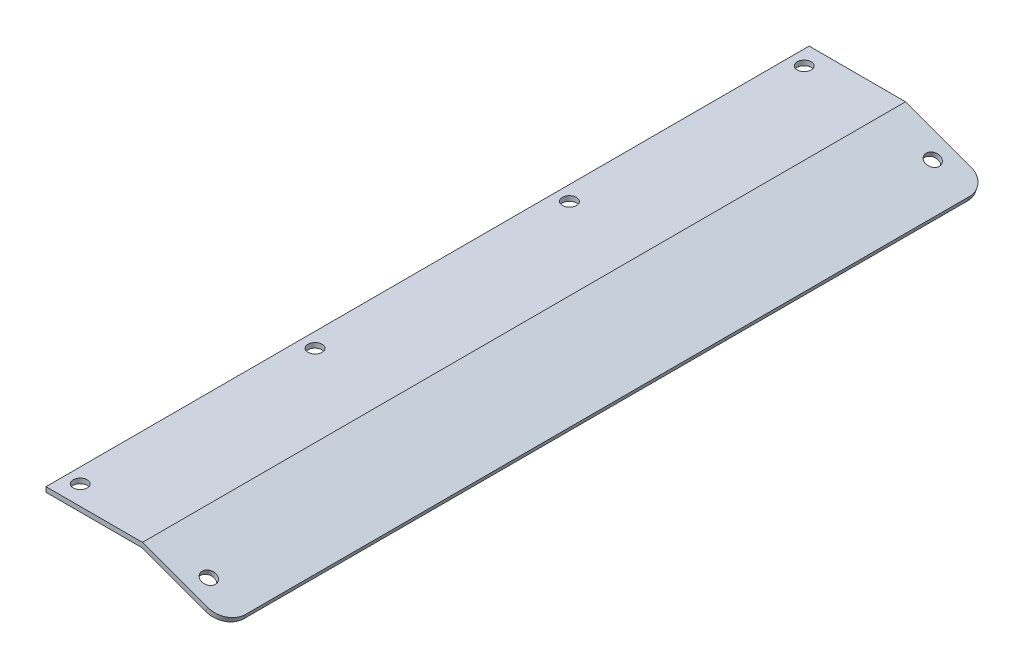
ISO-10303-21;
HEADER;
FILE_DESCRIPTION(('STEP AP214'),'2;1');
FILE_NAME('part.step','',(''),(''),'','','');
FILE_SCHEMA(('AUTOMOTIVE_DESIGN { 1 0 10303 214 1 1 1 1 }'));
ENDSEC;
DATA;
#1=APPLICATION_CONTEXT('core data for automotive mechanical design processes');
#2=APPLICATION_PROTOCOL_DEFINITION('international standard','automotive_design',2000,#1);
#3=PRODUCT_CONTEXT('',#1,'mechanical');
#4=PRODUCT('Part','Part','',(#3));
#5=PRODUCT_RELATED_PRODUCT_CATEGORY('part','',(#4));
#6=PRODUCT_DEFINITION_FORMATION('','',#4);
#7=PRODUCT_DEFINITION_CONTEXT('part definition',#1,'design');
#8=PRODUCT_DEFINITION('design','',#6,#7);
#9=PRODUCT_DEFINITION_SHAPE('','',#8);
#10=(LENGTH_UNIT() NAMED_UNIT(*) SI_UNIT(.MILLI.,.METRE.));
#11=(NAMED_UNIT(*) PLANE_ANGLE_UNIT() SI_UNIT($,.RADIAN.));
#12=(NAMED_UNIT(*) SI_UNIT($,.STERADIAN.) SOLID_ANGLE_UNIT());
#13=UNCERTAINTY_MEASURE_WITH_UNIT(LENGTH_MEASURE(1.E-05),#10,'distance_accuracy_value','');
#14=(GEOMETRIC_REPRESENTATION_CONTEXT(3) GLOBAL_UNCERTAINTY_ASSIGNED_CONTEXT((#13)) GLOBAL_UNIT_ASSIGNED_CONTEXT((#10,
#11,#12)) REPRESENTATION_CONTEXT('',''));
#15=CARTESIAN_POINT('',(0.,0.,0.));
#16=DIRECTION('',(0.,0.,1.));
#17=DIRECTION('',(1.,0.,0.));
#18=AXIS2_PLACEMENT_3D('',#15,#16,#17);
#19=CARTESIAN_POINT('',(0.,1.5875,307.158038592048));
#20=DIRECTION('',(1.,0.,0.));
#21=DIRECTION('',(0.,1.,0.));
#22=AXIS2_PLACEMENT_3D('',#19,#20,#21);
#23=PLANE('',#22);
#24=DIRECTION('',(0.,-1.,0.));
#25=VECTOR('',#24,1.);
#26=CARTESIAN_POINT('',(0.,1.58749999999937,247.649999999997));
#27=LINE('',#26,#25);
#28=CARTESIAN_POINT('',(0.,1.5875,247.649999999997));
#29=VERTEX_POINT('',#28);
#30=CARTESIAN_POINT('',(0.,0.,247.649999999996));
#31=VERTEX_POINT('',#30);
#32=EDGE_CURVE('E149',#29,#31,#27,.T.);
#33=ORIENTED_EDGE('',*,*,#32,.F.);
#34=DIRECTION('',(0.,0.,-1.));
#35=VECTOR('',#34,1.);
#36=CARTESIAN_POINT('',(0.,1.5875,307.158038592048));
#37=LINE('',#36,#35);
#38=CARTESIAN_POINT('',(0.,1.5875,0.));
#39=VERTEX_POINT('',#38);
#40=EDGE_CURVE('E146',#29,#39,#37,.T.);
#41=ORIENTED_EDGE('',*,*,#40,.T.);
#42=DIRECTION('',(0.,-1.,0.));
#43=VECTOR('',#42,1.);
#44=CARTESIAN_POINT('',(0.,1.5875,0.));
#45=LINE('',#44,#43);
#46=CARTESIAN_POINT('',(0.,0.,0.));
#47=VERTEX_POINT('',#46);
#48=EDGE_CURVE('E163',#39,#47,#45,.T.);
#49=ORIENTED_EDGE('',*,*,#48,.T.);
#50=DIRECTION('',(0.,0.,-1.));
#51=VECTOR('',#50,1.);
#52=CARTESIAN_POINT('',(0.,0.,307.158038592048));
#53=LINE('',#52,#51);
#54=EDGE_CURVE('E159',#31,#47,#53,.T.);
#55=ORIENTED_EDGE('',*,*,#54,.F.);
#56=EDGE_LOOP('',(#33,#41,#49,#55));
#57=FACE_BOUND('',#56,.T.);
#58=ADVANCED_FACE('F45',(#57),#23,.F.);
#59=CARTESIAN_POINT('',(0.,0.,307.158038592048));
#60=DIRECTION('',(0.,1.,0.));
#61=DIRECTION('',(-1.,0.,0.));
#62=AXIS2_PLACEMENT_3D('',#59,#60,#61);
#63=PLANE('',#62);
#64=CARTESIAN_POINT('',(4.7625,0.,6.35));
#65=DIRECTION('',(0.,1.,0.));
#66=DIRECTION('',(-1.,0.,0.));
#67=AXIS2_PLACEMENT_3D('',#64,#65,#66);
#68=CIRCLE('',#67,2.286);
#69=CARTESIAN_POINT('',(2.4765,0.,6.35));
#70=VERTEX_POINT('',#69);
#71=EDGE_CURVE('E177',#70,#70,#68,.T.);
#72=ORIENTED_EDGE('',*,*,#71,.T.);
#73=EDGE_LOOP('',(#72));
#74=FACE_BOUND('',#73,.T.);
#75=CARTESIAN_POINT('',(4.7625,0.,241.299999999997));
#76=DIRECTION('',(0.,1.,0.));
#77=DIRECTION('',(-1.,0.,0.));
#78=AXIS2_PLACEMENT_3D('',#75,#76,#77);
#79=CIRCLE('',#78,2.28600000000001);
#80=CARTESIAN_POINT('',(2.47649999999999,0.,241.299999999997));
#81=VERTEX_POINT('',#80);
#82=EDGE_CURVE('E311',#81,#81,#79,.T.);
#83=ORIENTED_EDGE('',*,*,#82,.T.);
#84=EDGE_LOOP('',(#83));
#85=FACE_BOUND('',#84,.T.);
#86=CARTESIAN_POINT('',(4.7625,0.,165.099999999997));
#87=DIRECTION('',(0.,1.,0.));
#88=DIRECTION('',(-1.,0.,0.));
#89=AXIS2_PLACEMENT_3D('',#86,#87,#88);
#90=CIRCLE('',#89,2.28600000000001);
#91=CARTESIAN_POINT('',(2.47649999999999,0.,165.099999999997));
#92=VERTEX_POINT('',#91);
#93=EDGE_CURVE('E308',#92,#92,#90,.T.);
#94=ORIENTED_EDGE('',*,*,#93,.T.);
#95=EDGE_LOOP('',(#94));
#96=FACE_BOUND('',#95,.T.);
#97=CARTESIAN_POINT('',(4.7625,0.,82.55));
#98=DIRECTION('',(0.,1.,0.));
#99=DIRECTION('',(-1.,0.,0.));
#100=AXIS2_PLACEMENT_3D('',#97,#98,#99);
#101=CIRCLE('',#100,2.286);
#102=CARTESIAN_POINT('',(2.4765,0.,82.55));
#103=VERTEX_POINT('',#102);
#104=EDGE_CURVE('E294',#103,#103,#101,.T.);
#105=ORIENTED_EDGE('',*,*,#104,.T.);
#106=EDGE_LOOP('',(#105));
#107=FACE_BOUND('',#106,.T.);
#108=DIRECTION('',(1.,0.,0.));
#109=VECTOR('',#108,1.);
#110=CARTESIAN_POINT('',(-8.29206744874864E-13,0.,247.649999999997));
#111=LINE('',#110,#109);
#112=CARTESIAN_POINT('',(31.0188571021414,0.,247.649999999996));
#113=VERTEX_POINT('',#112);
#114=EDGE_CURVE('E154',#31,#113,#111,.T.);
#115=ORIENTED_EDGE('',*,*,#114,.F.);
#116=ORIENTED_EDGE('',*,*,#54,.T.);
#117=DIRECTION('',(1.,0.,0.));
#118=VECTOR('',#117,1.);
#119=CARTESIAN_POINT('',(0.,0.,0.));
#120=LINE('',#119,#118);
#121=CARTESIAN_POINT('',(31.0188571021414,0.,0.));
#122=VERTEX_POINT('',#121);
#123=EDGE_CURVE('E162',#47,#122,#120,.T.);
#124=ORIENTED_EDGE('',*,*,#123,.T.);
#125=DIRECTION('',(0.,0.,-1.));
#126=VECTOR('',#125,1.);
#127=CARTESIAN_POINT('',(31.0188571021414,0.,307.158038592048));
#128=LINE('',#127,#126);
#129=EDGE_CURVE('E164',#113,#122,#128,.T.);
#130=ORIENTED_EDGE('',*,*,#129,.F.);
#131=EDGE_LOOP('',(#115,#116,#124,#130));
#132=FACE_BOUND('',#131,.T.);
#133=ADVANCED_FACE('F213',(#74,#85,#96,#107,#132),#63,.F.);
#134=CARTESIAN_POINT('',(31.0188571021414,0.,307.158038592048));
#135=DIRECTION('',(0.342020143325677,0.939692620785905,0.));
#136=DIRECTION('',(-0.939692620785905,0.342020143325677,0.));
#137=AXIS2_PLACEMENT_3D('',#134,#135,#136);
#138=PLANE('',#137);
#139=CARTESIAN_POINT('',(45.9364774571177,-5.42956977529513,6.35));
#140=DIRECTION('',(0.342020143325677,0.939692620785905,0.));
#141=DIRECTION('',(-0.939692620785905,0.342020143325677,0.));
#142=AXIS2_PLACEMENT_3D('',#139,#140,#141);
#143=CIRCLE('',#142,2.28599999999117);
#144=CARTESIAN_POINT('',(43.7883401260094,-4.64771172765565,6.35));
#145=VERTEX_POINT('',#144);
#146=EDGE_CURVE('E276',#145,#145,#143,.T.);
#147=ORIENTED_EDGE('',*,*,#146,.T.);
#148=EDGE_LOOP('',(#147));
#149=FACE_BOUND('',#148,.T.);
#150=CARTESIAN_POINT('',(45.9364774571177,-5.42956977529513,241.299999999997));
#151=DIRECTION('',(0.342020143325677,0.939692620785905,0.));
#152=DIRECTION('',(-0.939692620785905,0.342020143325677,0.));
#153=AXIS2_PLACEMENT_3D('',#150,#151,#152);
#154=CIRCLE('',#153,2.28599999999117);
#155=CARTESIAN_POINT('',(43.7883401260094,-4.64771172765565,241.299999999997));
#156=VERTEX_POINT('',#155);
#157=EDGE_CURVE('E279',#156,#156,#154,.T.);
#158=ORIENTED_EDGE('',*,*,#157,.T.);
#159=EDGE_LOOP('',(#158));
#160=FACE_BOUND('',#159,.T.);
#161=DIRECTION('',(0.939692620785905,-0.342020143325677,0.));
#162=VECTOR('',#161,1.);
#163=CARTESIAN_POINT('',(31.0188571021414,0.,0.));
#164=LINE('',#163,#162);
#165=CARTESIAN_POINT('',(51.9035255991082,-7.60139768541318,0.));
#166=VERTEX_POINT('',#165);
#167=EDGE_CURVE('E167',#122,#166,#164,.T.);
#168=ORIENTED_EDGE('',*,*,#167,.T.);
#169=CARTESIAN_POINT('',(51.9035255991082,-7.60139768541318,6.35000000000002));
#170=DIRECTION('',(0.342020143325677,0.939692620785905,0.));
#171=DIRECTION('',(-0.939692620785905,0.342020143325677,0.));
#172=AXIS2_PLACEMENT_3D('',#169,#170,#171);
#173=CIRCLE('',#172,6.35);
#174=CARTESIAN_POINT('',(57.8705737410987,-9.77322559553123,6.35000000000002));
#175=VERTEX_POINT('',#174);
#176=EDGE_CURVE('E54',#166,#175,#173,.F.);
#177=ORIENTED_EDGE('',*,*,#176,.T.);
#178=DIRECTION('',(0.,0.,-1.));
#179=VECTOR('',#178,1.);
#180=CARTESIAN_POINT('',(57.8705737410987,-9.77322559553123,307.158038592048));
#181=LINE('',#180,#179);
#182=CARTESIAN_POINT('',(57.8705737410987,-9.77322559553123,241.299999999996));
#183=VERTEX_POINT('',#182);
#184=EDGE_CURVE('E168',#183,#175,#181,.T.);
#185=ORIENTED_EDGE('',*,*,#184,.F.);
#186=CARTESIAN_POINT('',(51.9035255991082,-7.60139768541318,241.299999999996));
#187=DIRECTION('',(0.342020143325677,0.939692620785905,0.));
#188=DIRECTION('',(-0.939692620785905,0.342020143325677,0.));
#189=AXIS2_PLACEMENT_3D('',#186,#187,#188);
#190=CIRCLE('',#189,6.35);
#191=CARTESIAN_POINT('',(51.9035255991082,-7.6013976854132,247.649999999996));
#192=VERTEX_POINT('',#191);
#193=EDGE_CURVE('E64',#183,#192,#190,.F.);
#194=ORIENTED_EDGE('',*,*,#193,.T.);
#195=DIRECTION('',(0.939692620785905,-0.342020143325677,0.));
#196=VECTOR('',#195,1.);
#197=CARTESIAN_POINT('',(31.0188571021409,1.93296059186015E-13,247.649999999996));
#198=LINE('',#197,#196);
#199=EDGE_CURVE('E132',#113,#192,#198,.T.);
#200=ORIENTED_EDGE('',*,*,#199,.F.);
#201=ORIENTED_EDGE('',*,*,#129,.T.);
#202=EDGE_LOOP('',(#168,#177,#185,#194,#200,#201));
#203=FACE_BOUND('',#202,.T.);
#204=ADVANCED_FACE('F191',(#149,#160,#203),#138,.F.);
#205=CARTESIAN_POINT('',(57.8705737410987,-9.77322559553123,307.158038592048));
#206=DIRECTION('',(-0.939692620785904,0.342020143325682,0.));
#207=DIRECTION('',(-0.342020143325682,-0.939692620785904,0.));
#208=AXIS2_PLACEMENT_3D('',#205,#206,#207);
#209=PLANE('',#208);
#210=ORIENTED_EDGE('',*,*,#184,.T.);
#211=DIRECTION('',(0.342020143325682,0.939692620785904,0.));
#212=VECTOR('',#211,1.);
#213=CARTESIAN_POINT('',(57.8705737410987,-9.77322559553123,6.35000000000002));
#214=LINE('',#213,#212);
#215=CARTESIAN_POINT('',(58.4135307186282,-8.28146356003361,6.35000000000002));
#216=VERTEX_POINT('',#215);
#217=EDGE_CURVE('E180',#175,#216,#214,.T.);
#218=ORIENTED_EDGE('',*,*,#217,.T.);
#219=DIRECTION('',(0.,0.,-1.));
#220=VECTOR('',#219,1.);
#221=CARTESIAN_POINT('',(58.4135307186282,-8.28146356003361,307.158038592048));
#222=LINE('',#221,#220);
#223=CARTESIAN_POINT('',(58.4135307186282,-8.28146356003361,241.299999999996));
#224=VERTEX_POINT('',#223);
#225=EDGE_CURVE('E172',#224,#216,#222,.T.);
#226=ORIENTED_EDGE('',*,*,#225,.F.);
#227=DIRECTION('',(0.342020143325682,0.939692620785904,0.));
#228=VECTOR('',#227,1.);
#229=CARTESIAN_POINT('',(57.8705737410986,-9.77322559553132,241.299999999996));
#230=LINE('',#229,#228);
#231=EDGE_CURVE('E131',#224,#183,#230,.F.);
#232=ORIENTED_EDGE('',*,*,#231,.T.);
#233=EDGE_LOOP('',(#210,#218,#226,#232));
#234=FACE_BOUND('',#233,.T.);
#235=ADVANCED_FACE('F195',(#234),#209,.F.);
#236=CARTESIAN_POINT('',(58.4135307186282,-8.28146356003361,307.158038592048));
#237=DIRECTION('',(-0.342020143325677,-0.939692620785905,0.));
#238=DIRECTION('',(0.939692620785905,-0.342020143325677,0.));
#239=AXIS2_PLACEMENT_3D('',#236,#237,#238);
#240=PLANE('',#239);
#241=CARTESIAN_POINT('',(46.4794344346472,-3.93780773979737,6.35));
#242=DIRECTION('',(0.342020143325674,0.939692620785906,0.));
#243=DIRECTION('',(-0.939692620785906,0.342020143325674,0.));
#244=AXIS2_PLACEMENT_3D('',#241,#242,#243);
#245=CIRCLE('',#244,2.28599999999117);
#246=CARTESIAN_POINT('',(44.331297103539,-3.15594969215789,6.35));
#247=VERTEX_POINT('',#246);
#248=EDGE_CURVE('E282',#247,#247,#245,.T.);
#249=ORIENTED_EDGE('',*,*,#248,.F.);
#250=EDGE_LOOP('',(#249));
#251=FACE_BOUND('',#250,.T.);
#252=CARTESIAN_POINT('',(46.4794344346472,-3.93780773979737,241.299999999997));
#253=DIRECTION('',(0.342020143325674,0.939692620785906,0.));
#254=DIRECTION('',(-0.939692620785906,0.342020143325674,0.));
#255=AXIS2_PLACEMENT_3D('',#252,#253,#254);
#256=CIRCLE('',#255,2.28599999999117);
#257=CARTESIAN_POINT('',(44.331297103539,-3.15594969215789,241.299999999997));
#258=VERTEX_POINT('',#257);
#259=EDGE_CURVE('E287',#258,#258,#256,.T.);
#260=ORIENTED_EDGE('',*,*,#259,.F.);
#261=EDGE_LOOP('',(#260));
#262=FACE_BOUND('',#261,.T.);
#263=ORIENTED_EDGE('',*,*,#225,.T.);
#264=CARTESIAN_POINT('',(52.4464825766377,-6.10963564991556,6.35000000000002));
#265=DIRECTION('',(-0.342020143325677,-0.939692620785905,0.));
#266=DIRECTION('',(0.939692620785905,-0.342020143325677,0.));
#267=AXIS2_PLACEMENT_3D('',#264,#265,#266);
#268=CIRCLE('',#267,6.35);
#269=CARTESIAN_POINT('',(52.4464825766377,-6.10963564991556,0.));
#270=VERTEX_POINT('',#269);
#271=EDGE_CURVE('E186',#216,#270,#268,.F.);
#272=ORIENTED_EDGE('',*,*,#271,.T.);
#273=DIRECTION('',(-0.939692620785905,0.342020143325677,0.));
#274=VECTOR('',#273,1.);
#275=CARTESIAN_POINT('',(58.4135307186282,-8.28146356003361,0.));
#276=LINE('',#275,#274);
#277=CARTESIAN_POINT('',(31.2987761840161,1.5875,0.));
#278=VERTEX_POINT('',#277);
#279=EDGE_CURVE('E138',#270,#278,#276,.T.);
#280=ORIENTED_EDGE('',*,*,#279,.T.);
#281=DIRECTION('',(0.,0.,-1.));
#282=VECTOR('',#281,1.);
#283=CARTESIAN_POINT('',(31.2987761840161,1.5875,307.158038592048));
#284=LINE('',#283,#282);
#285=CARTESIAN_POINT('',(31.2987761840161,1.5875,247.649999999996));
#286=VERTEX_POINT('',#285);
#287=EDGE_CURVE('E135',#286,#278,#284,.T.);
#288=ORIENTED_EDGE('',*,*,#287,.F.);
#289=DIRECTION('',(-0.939692620785905,0.342020143325677,0.));
#290=VECTOR('',#289,1.);
#291=CARTESIAN_POINT('',(58.4135307186277,-8.28146356003341,247.649999999996));
#292=LINE('',#291,#290);
#293=CARTESIAN_POINT('',(52.4464825766377,-6.10963564991558,247.649999999996));
#294=VERTEX_POINT('',#293);
#295=EDGE_CURVE('E122',#294,#286,#292,.T.);
#296=ORIENTED_EDGE('',*,*,#295,.F.);
#297=CARTESIAN_POINT('',(52.4464825766377,-6.10963564991557,241.299999999996));
#298=DIRECTION('',(-0.342020143325677,-0.939692620785905,0.));
#299=DIRECTION('',(0.939692620785905,-0.342020143325677,0.));
#300=AXIS2_PLACEMENT_3D('',#297,#298,#299);
#301=CIRCLE('',#300,6.35);
#302=EDGE_CURVE('E183',#294,#224,#301,.F.);
#303=ORIENTED_EDGE('',*,*,#302,.T.);
#304=EDGE_LOOP('',(#263,#272,#280,#288,#296,#303));
#305=FACE_BOUND('',#304,.T.);
#306=ADVANCED_FACE('F137',(#251,#262,#305),#240,.F.);
#307=CARTESIAN_POINT('',(31.2987761840161,1.5875,307.158038592048));
#308=DIRECTION('',(0.,-1.,0.));
#309=DIRECTION('',(1.,0.,0.));
#310=AXIS2_PLACEMENT_3D('',#307,#308,#309);
#311=PLANE('',#310);
#312=CARTESIAN_POINT('',(4.7625,1.5875,6.35));
#313=DIRECTION('',(0.,1.,0.));
#314=DIRECTION('',(-1.,0.,0.));
#315=AXIS2_PLACEMENT_3D('',#312,#313,#314);
#316=CIRCLE('',#315,2.286);
#317=CARTESIAN_POINT('',(2.4765,1.5875,6.35));
#318=VERTEX_POINT('',#317);
#319=EDGE_CURVE('E291',#318,#318,#316,.T.);
#320=ORIENTED_EDGE('',*,*,#319,.F.);
#321=EDGE_LOOP('',(#320));
#322=FACE_BOUND('',#321,.T.);
#323=CARTESIAN_POINT('',(4.7625,1.5875,241.299999999997));
#324=DIRECTION('',(0.,1.,0.));
#325=DIRECTION('',(-1.,0.,0.));
#326=AXIS2_PLACEMENT_3D('',#323,#324,#325);
#327=CIRCLE('',#326,2.28600000000001);
#328=CARTESIAN_POINT('',(2.47649999999999,1.5875,241.299999999997));
#329=VERTEX_POINT('',#328);
#330=EDGE_CURVE('E295',#329,#329,#327,.T.);
#331=ORIENTED_EDGE('',*,*,#330,.F.);
#332=EDGE_LOOP('',(#331));
#333=FACE_BOUND('',#332,.T.);
#334=CARTESIAN_POINT('',(4.7625,1.5875,165.099999999997));
#335=DIRECTION('',(0.,1.,0.));
#336=DIRECTION('',(-1.,0.,0.));
#337=AXIS2_PLACEMENT_3D('',#334,#335,#336);
#338=CIRCLE('',#337,2.28600000000001);
#339=CARTESIAN_POINT('',(2.47649999999999,1.5875,165.099999999997));
#340=VERTEX_POINT('',#339);
#341=EDGE_CURVE('E299',#340,#340,#338,.T.);
#342=ORIENTED_EDGE('',*,*,#341,.F.);
#343=EDGE_LOOP('',(#342));
#344=FACE_BOUND('',#343,.T.);
#345=CARTESIAN_POINT('',(4.7625,1.5875,82.55));
#346=DIRECTION('',(0.,1.,0.));
#347=DIRECTION('',(-1.,0.,0.));
#348=AXIS2_PLACEMENT_3D('',#345,#346,#347);
#349=CIRCLE('',#348,2.286);
#350=CARTESIAN_POINT('',(2.4765,1.5875,82.55));
#351=VERTEX_POINT('',#350);
#352=EDGE_CURVE('E285',#351,#351,#349,.T.);
#353=ORIENTED_EDGE('',*,*,#352,.F.);
#354=EDGE_LOOP('',(#353));
#355=FACE_BOUND('',#354,.T.);
#356=DIRECTION('',(-1.,0.,0.));
#357=VECTOR('',#356,1.);
#358=CARTESIAN_POINT('',(31.2987761840153,1.5875,247.649999999996));
#359=LINE('',#358,#357);
#360=EDGE_CURVE('E127',#286,#29,#359,.T.);
#361=ORIENTED_EDGE('',*,*,#360,.F.);
#362=ORIENTED_EDGE('',*,*,#287,.T.);
#363=DIRECTION('',(-1.,0.,0.));
#364=VECTOR('',#363,1.);
#365=CARTESIAN_POINT('',(31.2987761840161,1.5875,0.));
#366=LINE('',#365,#364);
#367=EDGE_CURVE('E143',#278,#39,#366,.T.);
#368=ORIENTED_EDGE('',*,*,#367,.T.);
#369=ORIENTED_EDGE('',*,*,#40,.F.);
#370=EDGE_LOOP('',(#361,#362,#368,#369));
#371=FACE_BOUND('',#370,.T.);
#372=ADVANCED_FACE('F145',(#322,#333,#344,#355,#371),#311,.F.);
#373=CARTESIAN_POINT('',(0.,0.,0.));
#374=DIRECTION('',(0.,0.,1.));
#375=DIRECTION('',(1.,0.,0.));
#376=AXIS2_PLACEMENT_3D('',#373,#374,#375);
#377=PLANE('',#376);
#378=ORIENTED_EDGE('',*,*,#279,.F.);
#379=DIRECTION('',(0.342020143325682,0.939692620785904,0.));
#380=VECTOR('',#379,1.);
#381=CARTESIAN_POINT('',(48.2750086055357,-17.5706661913605,0.));
#382=LINE('',#381,#380);
#383=EDGE_CURVE('E72',#270,#166,#382,.F.);
#384=ORIENTED_EDGE('',*,*,#383,.T.);
#385=ORIENTED_EDGE('',*,*,#167,.F.);
#386=ORIENTED_EDGE('',*,*,#123,.F.);
#387=ORIENTED_EDGE('',*,*,#48,.F.);
#388=ORIENTED_EDGE('',*,*,#367,.F.);
#389=EDGE_LOOP('',(#378,#384,#385,#386,#387,#388));
#390=FACE_BOUND('',#389,.T.);
#391=ADVANCED_FACE('F199',(#390),#377,.F.);
#392=CARTESIAN_POINT('',(-147.602248226454,-127.891852162329,247.65));
#393=DIRECTION('',(0.,0.,1.));
#394=DIRECTION('',(0.798192165141458,0.602402911270182,0.));
#395=AXIS2_PLACEMENT_3D('',#392,#393,#394);
#396=PLANE('',#395);
#397=ORIENTED_EDGE('',*,*,#199,.T.);
#398=DIRECTION('',(0.342020143325682,0.939692620785904,0.));
#399=VECTOR('',#398,1.);
#400=CARTESIAN_POINT('',(52.4464825766378,-6.10963564991553,247.649999999996));
#401=LINE('',#400,#399);
#402=EDGE_CURVE('E11',#192,#294,#401,.T.);
#403=ORIENTED_EDGE('',*,*,#402,.T.);
#404=ORIENTED_EDGE('',*,*,#295,.T.);
#405=ORIENTED_EDGE('',*,*,#360,.T.);
#406=ORIENTED_EDGE('',*,*,#32,.T.);
#407=ORIENTED_EDGE('',*,*,#114,.T.);
#408=EDGE_LOOP('',(#397,#403,#404,#405,#406,#407));
#409=FACE_BOUND('',#408,.T.);
#410=ADVANCED_FACE('F124',(#409),#396,.T.);
#411=CARTESIAN_POINT('',(4.7625,-9.77322559553124,82.55));
#412=DIRECTION('',(0.,1.,0.));
#413=DIRECTION('',(-1.,0.,0.));
#414=AXIS2_PLACEMENT_3D('',#411,#412,#413);
#415=CYLINDRICAL_SURFACE('',#414,2.286);
#416=ORIENTED_EDGE('',*,*,#352,.T.);
#417=EDGE_LOOP('',(#416));
#418=FACE_BOUND('',#417,.T.);
#419=ORIENTED_EDGE('',*,*,#104,.F.);
#420=EDGE_LOOP('',(#419));
#421=FACE_BOUND('',#420,.T.);
#422=ADVANCED_FACE('F227',(#418,#421),#415,.F.);
#423=CARTESIAN_POINT('',(4.7625,-9.77322559553124,165.099999999997));
#424=DIRECTION('',(0.,1.,0.));
#425=DIRECTION('',(-1.,0.,0.));
#426=AXIS2_PLACEMENT_3D('',#423,#424,#425);
#427=CYLINDRICAL_SURFACE('',#426,2.28600000000001);
#428=ORIENTED_EDGE('',*,*,#341,.T.);
#429=EDGE_LOOP('',(#428));
#430=FACE_BOUND('',#429,.T.);
#431=ORIENTED_EDGE('',*,*,#93,.F.);
#432=EDGE_LOOP('',(#431));
#433=FACE_BOUND('',#432,.T.);
#434=ADVANCED_FACE('F254',(#430,#433),#427,.F.);
#435=CARTESIAN_POINT('',(4.7625,-9.77322559553124,241.299999999997));
#436=DIRECTION('',(0.,1.,0.));
#437=DIRECTION('',(-1.,0.,0.));
#438=AXIS2_PLACEMENT_3D('',#435,#436,#437);
#439=CYLINDRICAL_SURFACE('',#438,2.28600000000001);
#440=ORIENTED_EDGE('',*,*,#330,.T.);
#441=EDGE_LOOP('',(#440));
#442=FACE_BOUND('',#441,.T.);
#443=ORIENTED_EDGE('',*,*,#82,.F.);
#444=EDGE_LOOP('',(#443));
#445=FACE_BOUND('',#444,.T.);
#446=ADVANCED_FACE('F250',(#442,#445),#439,.F.);
#447=CARTESIAN_POINT('',(4.7625,-9.77322559553124,6.35));
#448=DIRECTION('',(0.,1.,0.));
#449=DIRECTION('',(-1.,0.,0.));
#450=AXIS2_PLACEMENT_3D('',#447,#448,#449);
#451=CYLINDRICAL_SURFACE('',#450,2.286);
#452=ORIENTED_EDGE('',*,*,#319,.T.);
#453=EDGE_LOOP('',(#452));
#454=FACE_BOUND('',#453,.T.);
#455=ORIENTED_EDGE('',*,*,#71,.F.);
#456=EDGE_LOOP('',(#455));
#457=FACE_BOUND('',#456,.T.);
#458=ADVANCED_FACE('F242',(#454,#457),#451,.F.);
#459=CARTESIAN_POINT('',(39.166906303806,-24.0288136584101,241.299999999997));
#460=DIRECTION('',(0.342020143325674,0.939692620785906,0.));
#461=DIRECTION('',(-0.939692620785906,0.342020143325674,0.));
#462=AXIS2_PLACEMENT_3D('',#459,#460,#461);
#463=CYLINDRICAL_SURFACE('',#462,2.28599999999117);
#464=ORIENTED_EDGE('',*,*,#259,.T.);
#465=EDGE_LOOP('',(#464));
#466=FACE_BOUND('',#465,.T.);
#467=ORIENTED_EDGE('',*,*,#157,.F.);
#468=EDGE_LOOP('',(#467));
#469=FACE_BOUND('',#468,.T.);
#470=ADVANCED_FACE('F235',(#466,#469),#463,.F.);
#471=CARTESIAN_POINT('',(39.166906303806,-24.0288136584101,6.35));
#472=DIRECTION('',(0.342020143325674,0.939692620785906,0.));
#473=DIRECTION('',(-0.939692620785906,0.342020143325674,0.));
#474=AXIS2_PLACEMENT_3D('',#471,#472,#473);
#475=CYLINDRICAL_SURFACE('',#474,2.28599999999117);
#476=ORIENTED_EDGE('',*,*,#248,.T.);
#477=EDGE_LOOP('',(#476));
#478=FACE_BOUND('',#477,.T.);
#479=ORIENTED_EDGE('',*,*,#146,.F.);
#480=EDGE_LOOP('',(#479));
#481=FACE_BOUND('',#480,.T.);
#482=ADVANCED_FACE('F229',(#478,#481),#475,.F.);
#483=CARTESIAN_POINT('',(51.9035255991082,-7.60139768541315,6.35000000000002));
#484=DIRECTION('',(0.342020143325682,0.939692620785904,0.));
#485=DIRECTION('',(-0.939692620785904,0.342020143325682,0.));
#486=AXIS2_PLACEMENT_3D('',#483,#484,#485);
#487=CYLINDRICAL_SURFACE('',#486,6.35);
#488=ORIENTED_EDGE('',*,*,#176,.F.);
#489=ORIENTED_EDGE('',*,*,#383,.F.);
#490=ORIENTED_EDGE('',*,*,#271,.F.);
#491=ORIENTED_EDGE('',*,*,#217,.F.);
#492=EDGE_LOOP('',(#488,#489,#490,#491));
#493=FACE_BOUND('',#492,.T.);
#494=ADVANCED_FACE('F198',(#493),#487,.T.);
#495=CARTESIAN_POINT('',(-10.0948234597262,-177.940461768019,241.299999999999));
#496=DIRECTION('',(-0.342020143325682,-0.939692620785904,0.));
#497=DIRECTION('',(0.939692620785904,-0.342020143325682,0.));
#498=AXIS2_PLACEMENT_3D('',#495,#496,#497);
#499=CYLINDRICAL_SURFACE('',#498,6.35);
#500=ORIENTED_EDGE('',*,*,#193,.F.);
#501=ORIENTED_EDGE('',*,*,#231,.F.);
#502=ORIENTED_EDGE('',*,*,#302,.F.);
#503=ORIENTED_EDGE('',*,*,#402,.F.);
#504=EDGE_LOOP('',(#500,#501,#502,#503));
#505=FACE_BOUND('',#504,.T.);
#506=ADVANCED_FACE('F47',(#505),#499,.T.);
#507=CLOSED_SHELL('',(#58,#133,#204,#235,#306,#372,#391,#410,#422,#434,#446,#458,#470,#482,#494,#506));
#508=MANIFOLD_SOLID_BREP('B2',#507);
#509=ADVANCED_BREP_SHAPE_REPRESENTATION('',(#18,#508),#14);
#510=SHAPE_DEFINITION_REPRESENTATION(#9,#509);
ENDSEC;
END-ISO-10303-21;
